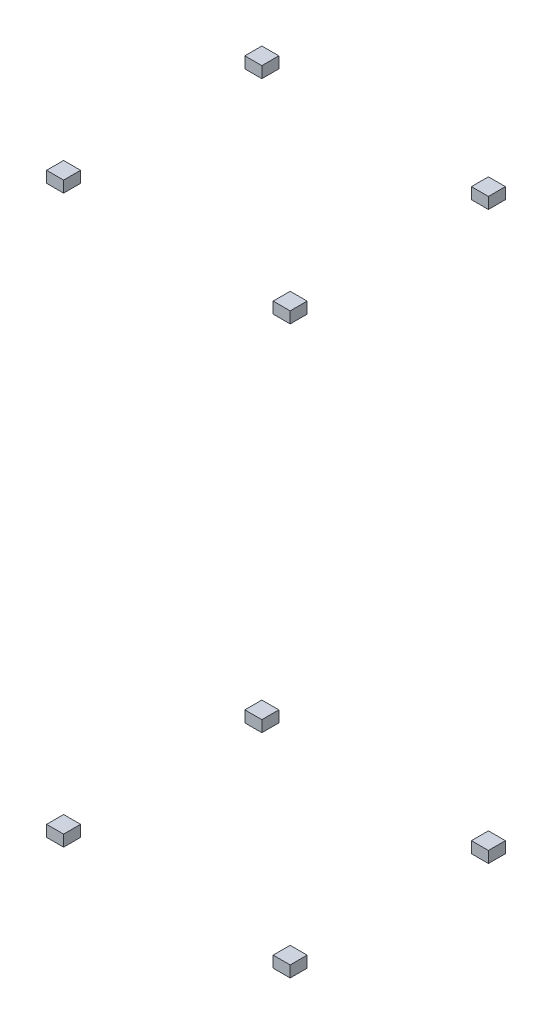
ISO-10303-21;
HEADER;
FILE_DESCRIPTION(('STEP AP214'),'2;1');
FILE_NAME('part.step','',(''),(''),'','','');
FILE_SCHEMA(('AUTOMOTIVE_DESIGN { 1 0 10303 214 1 1 1 1 }'));
ENDSEC;
DATA;
#1=APPLICATION_CONTEXT('core data for automotive mechanical design processes');
#2=APPLICATION_PROTOCOL_DEFINITION('international standard','automotive_design',2000,#1);
#3=PRODUCT_CONTEXT('',#1,'mechanical');
#4=PRODUCT('Part','Part','',(#3));
#5=PRODUCT_RELATED_PRODUCT_CATEGORY('part','',(#4));
#6=PRODUCT_DEFINITION_FORMATION('','',#4);
#7=PRODUCT_DEFINITION_CONTEXT('part definition',#1,'design');
#8=PRODUCT_DEFINITION('design','',#6,#7);
#9=PRODUCT_DEFINITION_SHAPE('','',#8);
#10=(LENGTH_UNIT() NAMED_UNIT(*) SI_UNIT(.MILLI.,.METRE.));
#11=(NAMED_UNIT(*) PLANE_ANGLE_UNIT() SI_UNIT($,.RADIAN.));
#12=(NAMED_UNIT(*) SI_UNIT($,.STERADIAN.) SOLID_ANGLE_UNIT());
#13=UNCERTAINTY_MEASURE_WITH_UNIT(LENGTH_MEASURE(1.E-05),#10,'distance_accuracy_value','');
#14=(GEOMETRIC_REPRESENTATION_CONTEXT(3) GLOBAL_UNCERTAINTY_ASSIGNED_CONTEXT((#13)) GLOBAL_UNIT_ASSIGNED_CONTEXT((#10,
#11,#12)) REPRESENTATION_CONTEXT('',''));
#15=CARTESIAN_POINT('',(0.,0.,0.));
#16=DIRECTION('',(0.,0.,1.));
#17=DIRECTION('',(1.,0.,0.));
#18=AXIS2_PLACEMENT_3D('',#15,#16,#17);
#19=CARTESIAN_POINT('',(740.,1960.,760.));
#20=DIRECTION('',(1.,0.,0.));
#21=DIRECTION('',(0.,0.,-1.));
#22=AXIS2_PLACEMENT_3D('',#19,#20,#21);
#23=PLANE('',#22);
#24=DIRECTION('',(0.,-1.,0.));
#25=VECTOR('',#24,1.);
#26=CARTESIAN_POINT('',(740.,1960.,640.));
#27=LINE('',#26,#25);
#28=CARTESIAN_POINT('',(740.,2040.,640.));
#29=VERTEX_POINT('',#28);
#30=CARTESIAN_POINT('',(740.,1960.,640.));
#31=VERTEX_POINT('',#30);
#32=EDGE_CURVE('E114',#29,#31,#27,.T.);
#33=ORIENTED_EDGE('',*,*,#32,.T.);
#34=DIRECTION('',(0.,0.,-1.));
#35=VECTOR('',#34,1.);
#36=CARTESIAN_POINT('',(740.,1960.,760.));
#37=LINE('',#36,#35);
#38=CARTESIAN_POINT('',(740.,1960.,760.));
#39=VERTEX_POINT('',#38);
#40=EDGE_CURVE('E12',#39,#31,#37,.T.);
#41=ORIENTED_EDGE('',*,*,#40,.F.);
#42=DIRECTION('',(0.,-1.,0.));
#43=VECTOR('',#42,1.);
#44=CARTESIAN_POINT('',(740.,1960.,760.));
#45=LINE('',#44,#43);
#46=CARTESIAN_POINT('',(740.,2040.,760.));
#47=VERTEX_POINT('',#46);
#48=EDGE_CURVE('E101',#47,#39,#45,.T.);
#49=ORIENTED_EDGE('',*,*,#48,.F.);
#50=DIRECTION('',(0.,0.,-1.));
#51=VECTOR('',#50,1.);
#52=CARTESIAN_POINT('',(740.,2040.,760.));
#53=LINE('',#52,#51);
#54=EDGE_CURVE('E108',#47,#29,#53,.T.);
#55=ORIENTED_EDGE('',*,*,#54,.T.);
#56=EDGE_LOOP('',(#33,#41,#49,#55));
#57=FACE_BOUND('',#56,.T.);
#58=ADVANCED_FACE('F49',(#57),#23,.F.);
#59=CARTESIAN_POINT('',(740.,1960.,760.));
#60=DIRECTION('',(0.,1.,0.));
#61=DIRECTION('',(0.,0.,1.));
#62=AXIS2_PLACEMENT_3D('',#59,#60,#61);
#63=PLANE('',#62);
#64=DIRECTION('',(1.,0.,0.));
#65=VECTOR('',#64,1.);
#66=CARTESIAN_POINT('',(740.,1960.,640.));
#67=LINE('',#66,#65);
#68=CARTESIAN_POINT('',(860.,1960.,640.));
#69=VERTEX_POINT('',#68);
#70=EDGE_CURVE('E104',#31,#69,#67,.T.);
#71=ORIENTED_EDGE('',*,*,#70,.T.);
#72=DIRECTION('',(0.,0.,-1.));
#73=VECTOR('',#72,1.);
#74=CARTESIAN_POINT('',(860.,1960.,760.));
#75=LINE('',#74,#73);
#76=CARTESIAN_POINT('',(860.,1960.,760.));
#77=VERTEX_POINT('',#76);
#78=EDGE_CURVE('E59',#77,#69,#75,.T.);
#79=ORIENTED_EDGE('',*,*,#78,.F.);
#80=DIRECTION('',(1.,0.,0.));
#81=VECTOR('',#80,1.);
#82=CARTESIAN_POINT('',(740.,1960.,760.));
#83=LINE('',#82,#81);
#84=EDGE_CURVE('E96',#39,#77,#83,.T.);
#85=ORIENTED_EDGE('',*,*,#84,.F.);
#86=ORIENTED_EDGE('',*,*,#40,.T.);
#87=EDGE_LOOP('',(#71,#79,#85,#86));
#88=FACE_BOUND('',#87,.T.);
#89=ADVANCED_FACE('F102',(#88),#63,.F.);
#90=CARTESIAN_POINT('',(860.,1960.,760.));
#91=DIRECTION('',(-1.,0.,0.));
#92=DIRECTION('',(0.,0.,1.));
#93=AXIS2_PLACEMENT_3D('',#90,#91,#92);
#94=PLANE('',#93);
#95=DIRECTION('',(0.,1.,0.));
#96=VECTOR('',#95,1.);
#97=CARTESIAN_POINT('',(860.,1960.,640.));
#98=LINE('',#97,#96);
#99=CARTESIAN_POINT('',(860.,2040.,640.));
#100=VERTEX_POINT('',#99);
#101=EDGE_CURVE('E84',#69,#100,#98,.T.);
#102=ORIENTED_EDGE('',*,*,#101,.T.);
#103=DIRECTION('',(0.,0.,-1.));
#104=VECTOR('',#103,1.);
#105=CARTESIAN_POINT('',(860.,2040.,760.));
#106=LINE('',#105,#104);
#107=CARTESIAN_POINT('',(860.,2040.,760.));
#108=VERTEX_POINT('',#107);
#109=EDGE_CURVE('E106',#108,#100,#106,.T.);
#110=ORIENTED_EDGE('',*,*,#109,.F.);
#111=DIRECTION('',(0.,1.,0.));
#112=VECTOR('',#111,1.);
#113=CARTESIAN_POINT('',(860.,1960.,760.));
#114=LINE('',#113,#112);
#115=EDGE_CURVE('E97',#77,#108,#114,.T.);
#116=ORIENTED_EDGE('',*,*,#115,.F.);
#117=ORIENTED_EDGE('',*,*,#78,.T.);
#118=EDGE_LOOP('',(#102,#110,#116,#117));
#119=FACE_BOUND('',#118,.T.);
#120=ADVANCED_FACE('F110',(#119),#94,.F.);
#121=CARTESIAN_POINT('',(740.,2040.,760.));
#122=DIRECTION('',(0.,-1.,0.));
#123=DIRECTION('',(0.,0.,-1.));
#124=AXIS2_PLACEMENT_3D('',#121,#122,#123);
#125=PLANE('',#124);
#126=DIRECTION('',(-1.,0.,0.));
#127=VECTOR('',#126,1.);
#128=CARTESIAN_POINT('',(740.,2040.,640.));
#129=LINE('',#128,#127);
#130=EDGE_CURVE('E90',#100,#29,#129,.T.);
#131=ORIENTED_EDGE('',*,*,#130,.T.);
#132=ORIENTED_EDGE('',*,*,#54,.F.);
#133=DIRECTION('',(-1.,0.,0.));
#134=VECTOR('',#133,1.);
#135=CARTESIAN_POINT('',(740.,2040.,760.));
#136=LINE('',#135,#134);
#137=EDGE_CURVE('E67',#108,#47,#136,.T.);
#138=ORIENTED_EDGE('',*,*,#137,.F.);
#139=ORIENTED_EDGE('',*,*,#109,.T.);
#140=EDGE_LOOP('',(#131,#132,#138,#139));
#141=FACE_BOUND('',#140,.T.);
#142=ADVANCED_FACE('F118',(#141),#125,.F.);
#143=CARTESIAN_POINT('',(0.,0.,760.));
#144=DIRECTION('',(0.,0.,-1.));
#145=DIRECTION('',(-1.,0.,0.));
#146=AXIS2_PLACEMENT_3D('',#143,#144,#145);
#147=PLANE('',#146);
#148=ORIENTED_EDGE('',*,*,#48,.T.);
#149=ORIENTED_EDGE('',*,*,#84,.T.);
#150=ORIENTED_EDGE('',*,*,#115,.T.);
#151=ORIENTED_EDGE('',*,*,#137,.T.);
#152=EDGE_LOOP('',(#148,#149,#150,#151));
#153=FACE_BOUND('',#152,.T.);
#154=ADVANCED_FACE('F100',(#153),#147,.F.);
#155=CARTESIAN_POINT('',(0.,0.,640.));
#156=DIRECTION('',(0.,0.,-1.));
#157=DIRECTION('',(-1.,0.,0.));
#158=AXIS2_PLACEMENT_3D('',#155,#156,#157);
#159=PLANE('',#158);
#160=ORIENTED_EDGE('',*,*,#32,.F.);
#161=ORIENTED_EDGE('',*,*,#130,.F.);
#162=ORIENTED_EDGE('',*,*,#101,.F.);
#163=ORIENTED_EDGE('',*,*,#70,.F.);
#164=EDGE_LOOP('',(#160,#161,#162,#163));
#165=FACE_BOUND('',#164,.T.);
#166=ADVANCED_FACE('F124',(#165),#159,.T.);
#167=CLOSED_SHELL('',(#58,#89,#120,#142,#154,#166));
#168=MANIFOLD_SOLID_BREP('B2',#167);
#169=CARTESIAN_POINT('',(740.,1960.,-640.));
#170=DIRECTION('',(1.,0.,0.));
#171=DIRECTION('',(0.,0.,-1.));
#172=AXIS2_PLACEMENT_3D('',#169,#170,#171);
#173=PLANE('',#172);
#174=DIRECTION('',(0.,-1.,0.));
#175=VECTOR('',#174,1.);
#176=CARTESIAN_POINT('',(740.,1960.,-760.));
#177=LINE('',#176,#175);
#178=CARTESIAN_POINT('',(740.,2040.,-760.));
#179=VERTEX_POINT('',#178);
#180=CARTESIAN_POINT('',(740.,1960.,-760.));
#181=VERTEX_POINT('',#180);
#182=EDGE_CURVE('E250',#179,#181,#177,.T.);
#183=ORIENTED_EDGE('',*,*,#182,.T.);
#184=DIRECTION('',(0.,0.,-1.));
#185=VECTOR('',#184,1.);
#186=CARTESIAN_POINT('',(740.,1960.,-640.));
#187=LINE('',#186,#185);
#188=CARTESIAN_POINT('',(740.,1960.,-640.));
#189=VERTEX_POINT('',#188);
#190=EDGE_CURVE('E48',#189,#181,#187,.T.);
#191=ORIENTED_EDGE('',*,*,#190,.F.);
#192=DIRECTION('',(0.,-1.,0.));
#193=VECTOR('',#192,1.);
#194=CARTESIAN_POINT('',(740.,1960.,-640.));
#195=LINE('',#194,#193);
#196=CARTESIAN_POINT('',(740.,2040.,-640.));
#197=VERTEX_POINT('',#196);
#198=EDGE_CURVE('E233',#197,#189,#195,.T.);
#199=ORIENTED_EDGE('',*,*,#198,.F.);
#200=DIRECTION('',(0.,0.,-1.));
#201=VECTOR('',#200,1.);
#202=CARTESIAN_POINT('',(740.,2040.,-640.));
#203=LINE('',#202,#201);
#204=EDGE_CURVE('E245',#197,#179,#203,.T.);
#205=ORIENTED_EDGE('',*,*,#204,.T.);
#206=EDGE_LOOP('',(#183,#191,#199,#205));
#207=FACE_BOUND('',#206,.T.);
#208=ADVANCED_FACE('F184',(#207),#173,.F.);
#209=CARTESIAN_POINT('',(740.,1960.,-640.));
#210=DIRECTION('',(0.,1.,0.));
#211=DIRECTION('',(0.,0.,1.));
#212=AXIS2_PLACEMENT_3D('',#209,#210,#211);
#213=PLANE('',#212);
#214=DIRECTION('',(1.,0.,0.));
#215=VECTOR('',#214,1.);
#216=CARTESIAN_POINT('',(740.,1960.,-760.));
#217=LINE('',#216,#215);
#218=CARTESIAN_POINT('',(860.,1960.,-760.));
#219=VERTEX_POINT('',#218);
#220=EDGE_CURVE('E239',#181,#219,#217,.T.);
#221=ORIENTED_EDGE('',*,*,#220,.T.);
#222=DIRECTION('',(0.,0.,-1.));
#223=VECTOR('',#222,1.);
#224=CARTESIAN_POINT('',(860.,1960.,-640.));
#225=LINE('',#224,#223);
#226=CARTESIAN_POINT('',(860.,1960.,-640.));
#227=VERTEX_POINT('',#226);
#228=EDGE_CURVE('E195',#227,#219,#225,.T.);
#229=ORIENTED_EDGE('',*,*,#228,.F.);
#230=DIRECTION('',(1.,0.,0.));
#231=VECTOR('',#230,1.);
#232=CARTESIAN_POINT('',(740.,1960.,-640.));
#233=LINE('',#232,#231);
#234=EDGE_CURVE('E228',#189,#227,#233,.T.);
#235=ORIENTED_EDGE('',*,*,#234,.F.);
#236=ORIENTED_EDGE('',*,*,#190,.T.);
#237=EDGE_LOOP('',(#221,#229,#235,#236));
#238=FACE_BOUND('',#237,.T.);
#239=ADVANCED_FACE('F236',(#238),#213,.F.);
#240=CARTESIAN_POINT('',(860.,1960.,-640.));
#241=DIRECTION('',(-1.,0.,0.));
#242=DIRECTION('',(0.,0.,1.));
#243=AXIS2_PLACEMENT_3D('',#240,#241,#242);
#244=PLANE('',#243);
#245=DIRECTION('',(0.,1.,0.));
#246=VECTOR('',#245,1.);
#247=CARTESIAN_POINT('',(860.,1960.,-760.));
#248=LINE('',#247,#246);
#249=CARTESIAN_POINT('',(860.,2040.,-760.));
#250=VERTEX_POINT('',#249);
#251=EDGE_CURVE('E220',#219,#250,#248,.T.);
#252=ORIENTED_EDGE('',*,*,#251,.T.);
#253=DIRECTION('',(0.,0.,-1.));
#254=VECTOR('',#253,1.);
#255=CARTESIAN_POINT('',(860.,2040.,-640.));
#256=LINE('',#255,#254);
#257=CARTESIAN_POINT('',(860.,2040.,-640.));
#258=VERTEX_POINT('',#257);
#259=EDGE_CURVE('E238',#258,#250,#256,.T.);
#260=ORIENTED_EDGE('',*,*,#259,.F.);
#261=DIRECTION('',(0.,1.,0.));
#262=VECTOR('',#261,1.);
#263=CARTESIAN_POINT('',(860.,1960.,-640.));
#264=LINE('',#263,#262);
#265=EDGE_CURVE('E234',#227,#258,#264,.T.);
#266=ORIENTED_EDGE('',*,*,#265,.F.);
#267=ORIENTED_EDGE('',*,*,#228,.T.);
#268=EDGE_LOOP('',(#252,#260,#266,#267));
#269=FACE_BOUND('',#268,.T.);
#270=ADVANCED_FACE('F242',(#269),#244,.F.);
#271=CARTESIAN_POINT('',(740.,2040.,-640.));
#272=DIRECTION('',(0.,-1.,0.));
#273=DIRECTION('',(0.,0.,-1.));
#274=AXIS2_PLACEMENT_3D('',#271,#272,#273);
#275=PLANE('',#274);
#276=DIRECTION('',(-1.,0.,0.));
#277=VECTOR('',#276,1.);
#278=CARTESIAN_POINT('',(740.,2040.,-760.));
#279=LINE('',#278,#277);
#280=EDGE_CURVE('E224',#250,#179,#279,.T.);
#281=ORIENTED_EDGE('',*,*,#280,.T.);
#282=ORIENTED_EDGE('',*,*,#204,.F.);
#283=DIRECTION('',(-1.,0.,0.));
#284=VECTOR('',#283,1.);
#285=CARTESIAN_POINT('',(740.,2040.,-640.));
#286=LINE('',#285,#284);
#287=EDGE_CURVE('E199',#258,#197,#286,.T.);
#288=ORIENTED_EDGE('',*,*,#287,.F.);
#289=ORIENTED_EDGE('',*,*,#259,.T.);
#290=EDGE_LOOP('',(#281,#282,#288,#289));
#291=FACE_BOUND('',#290,.T.);
#292=ADVANCED_FACE('F255',(#291),#275,.F.);
#293=CARTESIAN_POINT('',(0.,0.,-640.));
#294=DIRECTION('',(0.,0.,-1.));
#295=DIRECTION('',(-1.,0.,0.));
#296=AXIS2_PLACEMENT_3D('',#293,#294,#295);
#297=PLANE('',#296);
#298=ORIENTED_EDGE('',*,*,#198,.T.);
#299=ORIENTED_EDGE('',*,*,#234,.T.);
#300=ORIENTED_EDGE('',*,*,#265,.T.);
#301=ORIENTED_EDGE('',*,*,#287,.T.);
#302=EDGE_LOOP('',(#298,#299,#300,#301));
#303=FACE_BOUND('',#302,.T.);
#304=ADVANCED_FACE('F232',(#303),#297,.F.);
#305=CARTESIAN_POINT('',(0.,0.,-760.));
#306=DIRECTION('',(0.,0.,-1.));
#307=DIRECTION('',(-1.,0.,0.));
#308=AXIS2_PLACEMENT_3D('',#305,#306,#307);
#309=PLANE('',#308);
#310=ORIENTED_EDGE('',*,*,#182,.F.);
#311=ORIENTED_EDGE('',*,*,#280,.F.);
#312=ORIENTED_EDGE('',*,*,#251,.F.);
#313=ORIENTED_EDGE('',*,*,#220,.F.);
#314=EDGE_LOOP('',(#310,#311,#312,#313));
#315=FACE_BOUND('',#314,.T.);
#316=ADVANCED_FACE('F260',(#315),#309,.T.);
#317=CLOSED_SHELL('',(#208,#239,#270,#292,#304,#316));
#318=MANIFOLD_SOLID_BREP('B6',#317);
#319=CARTESIAN_POINT('',(740.,-2040.,760.));
#320=DIRECTION('',(1.,0.,0.));
#321=DIRECTION('',(0.,0.,-1.));
#322=AXIS2_PLACEMENT_3D('',#319,#320,#321);
#323=PLANE('',#322);
#324=DIRECTION('',(0.,-1.,0.));
#325=VECTOR('',#324,1.);
#326=CARTESIAN_POINT('',(740.,-2040.,640.));
#327=LINE('',#326,#325);
#328=CARTESIAN_POINT('',(740.,-1960.,640.));
#329=VERTEX_POINT('',#328);
#330=CARTESIAN_POINT('',(740.,-2040.,640.));
#331=VERTEX_POINT('',#330);
#332=EDGE_CURVE('E381',#329,#331,#327,.T.);
#333=ORIENTED_EDGE('',*,*,#332,.T.);
#334=DIRECTION('',(0.,0.,-1.));
#335=VECTOR('',#334,1.);
#336=CARTESIAN_POINT('',(740.,-2040.,760.));
#337=LINE('',#336,#335);
#338=CARTESIAN_POINT('',(740.,-2040.,760.));
#339=VERTEX_POINT('',#338);
#340=EDGE_CURVE('E185',#339,#331,#337,.T.);
#341=ORIENTED_EDGE('',*,*,#340,.F.);
#342=DIRECTION('',(0.,-1.,0.));
#343=VECTOR('',#342,1.);
#344=CARTESIAN_POINT('',(740.,-2040.,760.));
#345=LINE('',#344,#343);
#346=CARTESIAN_POINT('',(740.,-1960.,760.));
#347=VERTEX_POINT('',#346);
#348=EDGE_CURVE('E369',#347,#339,#345,.T.);
#349=ORIENTED_EDGE('',*,*,#348,.F.);
#350=DIRECTION('',(0.,0.,-1.));
#351=VECTOR('',#350,1.);
#352=CARTESIAN_POINT('',(740.,-1960.,760.));
#353=LINE('',#352,#351);
#354=EDGE_CURVE('E380',#347,#329,#353,.T.);
#355=ORIENTED_EDGE('',*,*,#354,.T.);
#356=EDGE_LOOP('',(#333,#341,#349,#355));
#357=FACE_BOUND('',#356,.T.);
#358=ADVANCED_FACE('F318',(#357),#323,.F.);
#359=CARTESIAN_POINT('',(740.,-2040.,760.));
#360=DIRECTION('',(0.,1.,0.));
#361=DIRECTION('',(0.,0.,1.));
#362=AXIS2_PLACEMENT_3D('',#359,#360,#361);
#363=PLANE('',#362);
#364=DIRECTION('',(1.,0.,0.));
#365=VECTOR('',#364,1.);
#366=CARTESIAN_POINT('',(740.,-2040.,640.));
#367=LINE('',#366,#365);
#368=CARTESIAN_POINT('',(860.,-2040.,640.));
#369=VERTEX_POINT('',#368);
#370=EDGE_CURVE('E373',#331,#369,#367,.T.);
#371=ORIENTED_EDGE('',*,*,#370,.T.);
#372=DIRECTION('',(0.,0.,-1.));
#373=VECTOR('',#372,1.);
#374=CARTESIAN_POINT('',(860.,-2040.,760.));
#375=LINE('',#374,#373);
#376=CARTESIAN_POINT('',(860.,-2040.,760.));
#377=VERTEX_POINT('',#376);
#378=EDGE_CURVE('E326',#377,#369,#375,.T.);
#379=ORIENTED_EDGE('',*,*,#378,.F.);
#380=DIRECTION('',(1.,0.,0.));
#381=VECTOR('',#380,1.);
#382=CARTESIAN_POINT('',(740.,-2040.,760.));
#383=LINE('',#382,#381);
#384=EDGE_CURVE('E365',#339,#377,#383,.T.);
#385=ORIENTED_EDGE('',*,*,#384,.F.);
#386=ORIENTED_EDGE('',*,*,#340,.T.);
#387=EDGE_LOOP('',(#371,#379,#385,#386));
#388=FACE_BOUND('',#387,.T.);
#389=ADVANCED_FACE('F375',(#388),#363,.F.);
#390=CARTESIAN_POINT('',(860.,-2040.,760.));
#391=DIRECTION('',(-1.,0.,0.));
#392=DIRECTION('',(0.,0.,1.));
#393=AXIS2_PLACEMENT_3D('',#390,#391,#392);
#394=PLANE('',#393);
#395=DIRECTION('',(0.,1.,0.));
#396=VECTOR('',#395,1.);
#397=CARTESIAN_POINT('',(860.,-2040.,640.));
#398=LINE('',#397,#396);
#399=CARTESIAN_POINT('',(860.,-1960.,640.));
#400=VERTEX_POINT('',#399);
#401=EDGE_CURVE('E352',#369,#400,#398,.T.);
#402=ORIENTED_EDGE('',*,*,#401,.T.);
#403=DIRECTION('',(0.,0.,-1.));
#404=VECTOR('',#403,1.);
#405=CARTESIAN_POINT('',(860.,-1960.,760.));
#406=LINE('',#405,#404);
#407=CARTESIAN_POINT('',(860.,-1960.,760.));
#408=VERTEX_POINT('',#407);
#409=EDGE_CURVE('E372',#408,#400,#406,.T.);
#410=ORIENTED_EDGE('',*,*,#409,.F.);
#411=DIRECTION('',(0.,1.,0.));
#412=VECTOR('',#411,1.);
#413=CARTESIAN_POINT('',(860.,-2040.,760.));
#414=LINE('',#413,#412);
#415=EDGE_CURVE('E370',#377,#408,#414,.T.);
#416=ORIENTED_EDGE('',*,*,#415,.F.);
#417=ORIENTED_EDGE('',*,*,#378,.T.);
#418=EDGE_LOOP('',(#402,#410,#416,#417));
#419=FACE_BOUND('',#418,.T.);
#420=ADVANCED_FACE('F374',(#419),#394,.F.);
#421=CARTESIAN_POINT('',(740.,-1960.,760.));
#422=DIRECTION('',(0.,-1.,0.));
#423=DIRECTION('',(0.,0.,-1.));
#424=AXIS2_PLACEMENT_3D('',#421,#422,#423);
#425=PLANE('',#424);
#426=DIRECTION('',(-1.,0.,0.));
#427=VECTOR('',#426,1.);
#428=CARTESIAN_POINT('',(740.,-1960.,640.));
#429=LINE('',#428,#427);
#430=EDGE_CURVE('E360',#400,#329,#429,.T.);
#431=ORIENTED_EDGE('',*,*,#430,.T.);
#432=ORIENTED_EDGE('',*,*,#354,.F.);
#433=DIRECTION('',(-1.,0.,0.));
#434=VECTOR('',#433,1.);
#435=CARTESIAN_POINT('',(740.,-1960.,760.));
#436=LINE('',#435,#434);
#437=EDGE_CURVE('E331',#408,#347,#436,.T.);
#438=ORIENTED_EDGE('',*,*,#437,.F.);
#439=ORIENTED_EDGE('',*,*,#409,.T.);
#440=EDGE_LOOP('',(#431,#432,#438,#439));
#441=FACE_BOUND('',#440,.T.);
#442=ADVANCED_FACE('F389',(#441),#425,.F.);
#443=CARTESIAN_POINT('',(0.,0.,760.));
#444=DIRECTION('',(0.,0.,-1.));
#445=DIRECTION('',(-1.,0.,0.));
#446=AXIS2_PLACEMENT_3D('',#443,#444,#445);
#447=PLANE('',#446);
#448=ORIENTED_EDGE('',*,*,#348,.T.);
#449=ORIENTED_EDGE('',*,*,#384,.T.);
#450=ORIENTED_EDGE('',*,*,#415,.T.);
#451=ORIENTED_EDGE('',*,*,#437,.T.);
#452=EDGE_LOOP('',(#448,#449,#450,#451));
#453=FACE_BOUND('',#452,.T.);
#454=ADVANCED_FACE('F364',(#453),#447,.F.);
#455=CARTESIAN_POINT('',(0.,0.,640.));
#456=DIRECTION('',(0.,0.,-1.));
#457=DIRECTION('',(-1.,0.,0.));
#458=AXIS2_PLACEMENT_3D('',#455,#456,#457);
#459=PLANE('',#458);
#460=ORIENTED_EDGE('',*,*,#332,.F.);
#461=ORIENTED_EDGE('',*,*,#430,.F.);
#462=ORIENTED_EDGE('',*,*,#401,.F.);
#463=ORIENTED_EDGE('',*,*,#370,.F.);
#464=EDGE_LOOP('',(#460,#461,#462,#463));
#465=FACE_BOUND('',#464,.T.);
#466=ADVANCED_FACE('F392',(#465),#459,.T.);
#467=CLOSED_SHELL('',(#358,#389,#420,#442,#454,#466));
#468=MANIFOLD_SOLID_BREP('B45',#467);
#469=CARTESIAN_POINT('',(740.,-2040.,-640.));
#470=DIRECTION('',(1.,0.,0.));
#471=DIRECTION('',(0.,0.,-1.));
#472=AXIS2_PLACEMENT_3D('',#469,#470,#471);
#473=PLANE('',#472);
#474=DIRECTION('',(0.,-1.,0.));
#475=VECTOR('',#474,1.);
#476=CARTESIAN_POINT('',(740.,-2040.,-760.));
#477=LINE('',#476,#475);
#478=CARTESIAN_POINT('',(740.,-1960.,-760.));
#479=VERTEX_POINT('',#478);
#480=CARTESIAN_POINT('',(740.,-2040.,-760.));
#481=VERTEX_POINT('',#480);
#482=EDGE_CURVE('E513',#479,#481,#477,.T.);
#483=ORIENTED_EDGE('',*,*,#482,.T.);
#484=DIRECTION('',(0.,0.,-1.));
#485=VECTOR('',#484,1.);
#486=CARTESIAN_POINT('',(740.,-2040.,-640.));
#487=LINE('',#486,#485);
#488=CARTESIAN_POINT('',(740.,-2040.,-640.));
#489=VERTEX_POINT('',#488);
#490=EDGE_CURVE('E316',#489,#481,#487,.T.);
#491=ORIENTED_EDGE('',*,*,#490,.F.);
#492=DIRECTION('',(0.,-1.,0.));
#493=VECTOR('',#492,1.);
#494=CARTESIAN_POINT('',(740.,-2040.,-640.));
#495=LINE('',#494,#493);
#496=CARTESIAN_POINT('',(740.,-1960.,-640.));
#497=VERTEX_POINT('',#496);
#498=EDGE_CURVE('E505',#497,#489,#495,.T.);
#499=ORIENTED_EDGE('',*,*,#498,.F.);
#500=DIRECTION('',(0.,0.,-1.));
#501=VECTOR('',#500,1.);
#502=CARTESIAN_POINT('',(740.,-1960.,-640.));
#503=LINE('',#502,#501);
#504=EDGE_CURVE('E512',#497,#479,#503,.T.);
#505=ORIENTED_EDGE('',*,*,#504,.T.);
#506=EDGE_LOOP('',(#483,#491,#499,#505));
#507=FACE_BOUND('',#506,.T.);
#508=ADVANCED_FACE('F455',(#507),#473,.F.);
#509=CARTESIAN_POINT('',(740.,-2040.,-640.));
#510=DIRECTION('',(0.,1.,0.));
#511=DIRECTION('',(0.,0.,1.));
#512=AXIS2_PLACEMENT_3D('',#509,#510,#511);
#513=PLANE('',#512);
#514=DIRECTION('',(1.,0.,0.));
#515=VECTOR('',#514,1.);
#516=CARTESIAN_POINT('',(740.,-2040.,-760.));
#517=LINE('',#516,#515);
#518=CARTESIAN_POINT('',(860.,-2040.,-760.));
#519=VERTEX_POINT('',#518);
#520=EDGE_CURVE('E510',#481,#519,#517,.T.);
#521=ORIENTED_EDGE('',*,*,#520,.T.);
#522=DIRECTION('',(0.,0.,-1.));
#523=VECTOR('',#522,1.);
#524=CARTESIAN_POINT('',(860.,-2040.,-640.));
#525=LINE('',#524,#523);
#526=CARTESIAN_POINT('',(860.,-2040.,-640.));
#527=VERTEX_POINT('',#526);
#528=EDGE_CURVE('E458',#527,#519,#525,.T.);
#529=ORIENTED_EDGE('',*,*,#528,.F.);
#530=DIRECTION('',(1.,0.,0.));
#531=VECTOR('',#530,1.);
#532=CARTESIAN_POINT('',(740.,-2040.,-640.));
#533=LINE('',#532,#531);
#534=EDGE_CURVE('E499',#489,#527,#533,.T.);
#535=ORIENTED_EDGE('',*,*,#534,.F.);
#536=ORIENTED_EDGE('',*,*,#490,.T.);
#537=EDGE_LOOP('',(#521,#529,#535,#536));
#538=FACE_BOUND('',#537,.T.);
#539=ADVANCED_FACE('F507',(#538),#513,.F.);
#540=CARTESIAN_POINT('',(860.,-2040.,-640.));
#541=DIRECTION('',(-1.,0.,0.));
#542=DIRECTION('',(0.,0.,1.));
#543=AXIS2_PLACEMENT_3D('',#540,#541,#542);
#544=PLANE('',#543);
#545=DIRECTION('',(0.,1.,0.));
#546=VECTOR('',#545,1.);
#547=CARTESIAN_POINT('',(860.,-2040.,-760.));
#548=LINE('',#547,#546);
#549=CARTESIAN_POINT('',(860.,-1960.,-760.));
#550=VERTEX_POINT('',#549);
#551=EDGE_CURVE('E484',#519,#550,#548,.T.);
#552=ORIENTED_EDGE('',*,*,#551,.T.);
#553=DIRECTION('',(0.,0.,-1.));
#554=VECTOR('',#553,1.);
#555=CARTESIAN_POINT('',(860.,-1960.,-640.));
#556=LINE('',#555,#554);
#557=CARTESIAN_POINT('',(860.,-1960.,-640.));
#558=VERTEX_POINT('',#557);
#559=EDGE_CURVE('E509',#558,#550,#556,.T.);
#560=ORIENTED_EDGE('',*,*,#559,.F.);
#561=DIRECTION('',(0.,1.,0.));
#562=VECTOR('',#561,1.);
#563=CARTESIAN_POINT('',(860.,-2040.,-640.));
#564=LINE('',#563,#562);
#565=EDGE_CURVE('E502',#527,#558,#564,.T.);
#566=ORIENTED_EDGE('',*,*,#565,.F.);
#567=ORIENTED_EDGE('',*,*,#528,.T.);
#568=EDGE_LOOP('',(#552,#560,#566,#567));
#569=FACE_BOUND('',#568,.T.);
#570=ADVANCED_FACE('F506',(#569),#544,.F.);
#571=CARTESIAN_POINT('',(740.,-1960.,-640.));
#572=DIRECTION('',(0.,-1.,0.));
#573=DIRECTION('',(0.,0.,-1.));
#574=AXIS2_PLACEMENT_3D('',#571,#572,#573);
#575=PLANE('',#574);
#576=DIRECTION('',(-1.,0.,0.));
#577=VECTOR('',#576,1.);
#578=CARTESIAN_POINT('',(740.,-1960.,-760.));
#579=LINE('',#578,#577);
#580=EDGE_CURVE('E491',#550,#479,#579,.T.);
#581=ORIENTED_EDGE('',*,*,#580,.T.);
#582=ORIENTED_EDGE('',*,*,#504,.F.);
#583=DIRECTION('',(-1.,0.,0.));
#584=VECTOR('',#583,1.);
#585=CARTESIAN_POINT('',(740.,-1960.,-640.));
#586=LINE('',#585,#584);
#587=EDGE_CURVE('E469',#558,#497,#586,.T.);
#588=ORIENTED_EDGE('',*,*,#587,.F.);
#589=ORIENTED_EDGE('',*,*,#559,.T.);
#590=EDGE_LOOP('',(#581,#582,#588,#589));
#591=FACE_BOUND('',#590,.T.);
#592=ADVANCED_FACE('F525',(#591),#575,.F.);
#593=CARTESIAN_POINT('',(0.,0.,-640.));
#594=DIRECTION('',(0.,0.,-1.));
#595=DIRECTION('',(-1.,0.,0.));
#596=AXIS2_PLACEMENT_3D('',#593,#594,#595);
#597=PLANE('',#596);
#598=ORIENTED_EDGE('',*,*,#498,.T.);
#599=ORIENTED_EDGE('',*,*,#534,.T.);
#600=ORIENTED_EDGE('',*,*,#565,.T.);
#601=ORIENTED_EDGE('',*,*,#587,.T.);
#602=EDGE_LOOP('',(#598,#599,#600,#601));
#603=FACE_BOUND('',#602,.T.);
#604=ADVANCED_FACE('F496',(#603),#597,.F.);
#605=CARTESIAN_POINT('',(0.,0.,-760.));
#606=DIRECTION('',(0.,0.,-1.));
#607=DIRECTION('',(-1.,0.,0.));
#608=AXIS2_PLACEMENT_3D('',#605,#606,#607);
#609=PLANE('',#608);
#610=ORIENTED_EDGE('',*,*,#482,.F.);
#611=ORIENTED_EDGE('',*,*,#580,.F.);
#612=ORIENTED_EDGE('',*,*,#551,.F.);
#613=ORIENTED_EDGE('',*,*,#520,.F.);
#614=EDGE_LOOP('',(#610,#611,#612,#613));
#615=FACE_BOUND('',#614,.T.);
#616=ADVANCED_FACE('F523',(#615),#609,.T.);
#617=CLOSED_SHELL('',(#508,#539,#570,#592,#604,#616));
#618=MANIFOLD_SOLID_BREP('B177',#617);
#619=CARTESIAN_POINT('',(-860.,1960.,760.));
#620=DIRECTION('',(1.,0.,0.));
#621=DIRECTION('',(0.,0.,-1.));
#622=AXIS2_PLACEMENT_3D('',#619,#620,#621);
#623=PLANE('',#622);
#624=DIRECTION('',(0.,-1.,0.));
#625=VECTOR('',#624,1.);
#626=CARTESIAN_POINT('',(-860.,1960.,640.));
#627=LINE('',#626,#625);
#628=CARTESIAN_POINT('',(-860.,2040.,640.));
#629=VERTEX_POINT('',#628);
#630=CARTESIAN_POINT('',(-860.,1960.,640.));
#631=VERTEX_POINT('',#630);
#632=EDGE_CURVE('E647',#629,#631,#627,.T.);
#633=ORIENTED_EDGE('',*,*,#632,.T.);
#634=DIRECTION('',(0.,0.,-1.));
#635=VECTOR('',#634,1.);
#636=CARTESIAN_POINT('',(-860.,1960.,760.));
#637=LINE('',#636,#635);
#638=CARTESIAN_POINT('',(-860.,1960.,760.));
#639=VERTEX_POINT('',#638);
#640=EDGE_CURVE('E448',#639,#631,#637,.T.);
#641=ORIENTED_EDGE('',*,*,#640,.F.);
#642=DIRECTION('',(0.,-1.,0.));
#643=VECTOR('',#642,1.);
#644=CARTESIAN_POINT('',(-860.,1960.,760.));
#645=LINE('',#644,#643);
#646=CARTESIAN_POINT('',(-860.,2040.,760.));
#647=VERTEX_POINT('',#646);
#648=EDGE_CURVE('E637',#647,#639,#645,.T.);
#649=ORIENTED_EDGE('',*,*,#648,.F.);
#650=DIRECTION('',(0.,0.,-1.));
#651=VECTOR('',#650,1.);
#652=CARTESIAN_POINT('',(-860.,2040.,760.));
#653=LINE('',#652,#651);
#654=EDGE_CURVE('E642',#647,#629,#653,.T.);
#655=ORIENTED_EDGE('',*,*,#654,.T.);
#656=EDGE_LOOP('',(#633,#641,#649,#655));
#657=FACE_BOUND('',#656,.T.);
#658=ADVANCED_FACE('F588',(#657),#623,.F.);
#659=CARTESIAN_POINT('',(-860.,1960.,760.));
#660=DIRECTION('',(0.,1.,0.));
#661=DIRECTION('',(0.,0.,1.));
#662=AXIS2_PLACEMENT_3D('',#659,#660,#661);
#663=PLANE('',#662);
#664=DIRECTION('',(1.,0.,0.));
#665=VECTOR('',#664,1.);
#666=CARTESIAN_POINT('',(-860.,1960.,640.));
#667=LINE('',#666,#665);
#668=CARTESIAN_POINT('',(-740.,1960.,640.));
#669=VERTEX_POINT('',#668);
#670=EDGE_CURVE('E643',#631,#669,#667,.T.);
#671=ORIENTED_EDGE('',*,*,#670,.T.);
#672=DIRECTION('',(0.,0.,-1.));
#673=VECTOR('',#672,1.);
#674=CARTESIAN_POINT('',(-740.,1960.,760.));
#675=LINE('',#674,#673);
#676=CARTESIAN_POINT('',(-740.,1960.,760.));
#677=VERTEX_POINT('',#676);
#678=EDGE_CURVE('E592',#677,#669,#675,.T.);
#679=ORIENTED_EDGE('',*,*,#678,.F.);
#680=DIRECTION('',(1.,0.,0.));
#681=VECTOR('',#680,1.);
#682=CARTESIAN_POINT('',(-860.,1960.,760.));
#683=LINE('',#682,#681);
#684=EDGE_CURVE('E635',#639,#677,#683,.T.);
#685=ORIENTED_EDGE('',*,*,#684,.F.);
#686=ORIENTED_EDGE('',*,*,#640,.T.);
#687=EDGE_LOOP('',(#671,#679,#685,#686));
#688=FACE_BOUND('',#687,.T.);
#689=ADVANCED_FACE('F639',(#688),#663,.F.);
#690=CARTESIAN_POINT('',(-740.,1960.,760.));
#691=DIRECTION('',(-1.,0.,0.));
#692=DIRECTION('',(0.,0.,1.));
#693=AXIS2_PLACEMENT_3D('',#690,#691,#692);
#694=PLANE('',#693);
#695=DIRECTION('',(0.,1.,0.));
#696=VECTOR('',#695,1.);
#697=CARTESIAN_POINT('',(-740.,1960.,640.));
#698=LINE('',#697,#696);
#699=CARTESIAN_POINT('',(-740.,2040.,640.));
#700=VERTEX_POINT('',#699);
#701=EDGE_CURVE('E616',#669,#700,#698,.T.);
#702=ORIENTED_EDGE('',*,*,#701,.T.);
#703=DIRECTION('',(0.,0.,-1.));
#704=VECTOR('',#703,1.);
#705=CARTESIAN_POINT('',(-740.,2040.,760.));
#706=LINE('',#705,#704);
#707=CARTESIAN_POINT('',(-740.,2040.,760.));
#708=VERTEX_POINT('',#707);
#709=EDGE_CURVE('E645',#708,#700,#706,.T.);
#710=ORIENTED_EDGE('',*,*,#709,.F.);
#711=DIRECTION('',(0.,1.,0.));
#712=VECTOR('',#711,1.);
#713=CARTESIAN_POINT('',(-740.,1960.,760.));
#714=LINE('',#713,#712);
#715=EDGE_CURVE('E633',#677,#708,#714,.T.);
#716=ORIENTED_EDGE('',*,*,#715,.F.);
#717=ORIENTED_EDGE('',*,*,#678,.T.);
#718=EDGE_LOOP('',(#702,#710,#716,#717));
#719=FACE_BOUND('',#718,.T.);
#720=ADVANCED_FACE('F641',(#719),#694,.F.);
#721=CARTESIAN_POINT('',(-860.,2040.,760.));
#722=DIRECTION('',(0.,-1.,0.));
#723=DIRECTION('',(0.,0.,-1.));
#724=AXIS2_PLACEMENT_3D('',#721,#722,#723);
#725=PLANE('',#724);
#726=DIRECTION('',(-1.,0.,0.));
#727=VECTOR('',#726,1.);
#728=CARTESIAN_POINT('',(-860.,2040.,640.));
#729=LINE('',#728,#727);
#730=EDGE_CURVE('E623',#700,#629,#729,.T.);
#731=ORIENTED_EDGE('',*,*,#730,.T.);
#732=ORIENTED_EDGE('',*,*,#654,.F.);
#733=DIRECTION('',(-1.,0.,0.));
#734=VECTOR('',#733,1.);
#735=CARTESIAN_POINT('',(-860.,2040.,760.));
#736=LINE('',#735,#734);
#737=EDGE_CURVE('E605',#708,#647,#736,.T.);
#738=ORIENTED_EDGE('',*,*,#737,.F.);
#739=ORIENTED_EDGE('',*,*,#709,.T.);
#740=EDGE_LOOP('',(#731,#732,#738,#739));
#741=FACE_BOUND('',#740,.T.);
#742=ADVANCED_FACE('F656',(#741),#725,.F.);
#743=CARTESIAN_POINT('',(0.,0.,760.));
#744=DIRECTION('',(0.,0.,-1.));
#745=DIRECTION('',(-1.,0.,0.));
#746=AXIS2_PLACEMENT_3D('',#743,#744,#745);
#747=PLANE('',#746);
#748=ORIENTED_EDGE('',*,*,#648,.T.);
#749=ORIENTED_EDGE('',*,*,#684,.T.);
#750=ORIENTED_EDGE('',*,*,#715,.T.);
#751=ORIENTED_EDGE('',*,*,#737,.T.);
#752=EDGE_LOOP('',(#748,#749,#750,#751));
#753=FACE_BOUND('',#752,.T.);
#754=ADVANCED_FACE('F634',(#753),#747,.F.);
#755=CARTESIAN_POINT('',(0.,0.,640.));
#756=DIRECTION('',(0.,0.,-1.));
#757=DIRECTION('',(-1.,0.,0.));
#758=AXIS2_PLACEMENT_3D('',#755,#756,#757);
#759=PLANE('',#758);
#760=ORIENTED_EDGE('',*,*,#632,.F.);
#761=ORIENTED_EDGE('',*,*,#730,.F.);
#762=ORIENTED_EDGE('',*,*,#701,.F.);
#763=ORIENTED_EDGE('',*,*,#670,.F.);
#764=EDGE_LOOP('',(#760,#761,#762,#763));
#765=FACE_BOUND('',#764,.T.);
#766=ADVANCED_FACE('F658',(#765),#759,.T.);
#767=CLOSED_SHELL('',(#658,#689,#720,#742,#754,#766));
#768=MANIFOLD_SOLID_BREP('B309',#767);
#769=CARTESIAN_POINT('',(-860.,1960.,-640.));
#770=DIRECTION('',(1.,0.,0.));
#771=DIRECTION('',(0.,0.,-1.));
#772=AXIS2_PLACEMENT_3D('',#769,#770,#771);
#773=PLANE('',#772);
#774=DIRECTION('',(0.,-1.,0.));
#775=VECTOR('',#774,1.);
#776=CARTESIAN_POINT('',(-860.,1960.,-760.));
#777=LINE('',#776,#775);
#778=CARTESIAN_POINT('',(-860.,2040.,-760.));
#779=VERTEX_POINT('',#778);
#780=CARTESIAN_POINT('',(-860.,1960.,-760.));
#781=VERTEX_POINT('',#780);
#782=EDGE_CURVE('E784',#779,#781,#777,.T.);
#783=ORIENTED_EDGE('',*,*,#782,.T.);
#784=DIRECTION('',(0.,0.,-1.));
#785=VECTOR('',#784,1.);
#786=CARTESIAN_POINT('',(-860.,1960.,-640.));
#787=LINE('',#786,#785);
#788=CARTESIAN_POINT('',(-860.,1960.,-640.));
#789=VERTEX_POINT('',#788);
#790=EDGE_CURVE('E585',#789,#781,#787,.T.);
#791=ORIENTED_EDGE('',*,*,#790,.F.);
#792=DIRECTION('',(0.,-1.,0.));
#793=VECTOR('',#792,1.);
#794=CARTESIAN_POINT('',(-860.,1960.,-640.));
#795=LINE('',#794,#793);
#796=CARTESIAN_POINT('',(-860.,2040.,-640.));
#797=VERTEX_POINT('',#796);
#798=EDGE_CURVE('E772',#797,#789,#795,.T.);
#799=ORIENTED_EDGE('',*,*,#798,.F.);
#800=DIRECTION('',(0.,0.,-1.));
#801=VECTOR('',#800,1.);
#802=CARTESIAN_POINT('',(-860.,2040.,-640.));
#803=LINE('',#802,#801);
#804=EDGE_CURVE('E776',#797,#779,#803,.T.);
#805=ORIENTED_EDGE('',*,*,#804,.T.);
#806=EDGE_LOOP('',(#783,#791,#799,#805));
#807=FACE_BOUND('',#806,.T.);
#808=ADVANCED_FACE('F718',(#807),#773,.F.);
#809=CARTESIAN_POINT('',(-860.,1960.,-640.));
#810=DIRECTION('',(0.,1.,0.));
#811=DIRECTION('',(0.,0.,1.));
#812=AXIS2_PLACEMENT_3D('',#809,#810,#811);
#813=PLANE('',#812);
#814=DIRECTION('',(1.,0.,0.));
#815=VECTOR('',#814,1.);
#816=CARTESIAN_POINT('',(-860.,1960.,-760.));
#817=LINE('',#816,#815);
#818=CARTESIAN_POINT('',(-740.,1960.,-760.));
#819=VERTEX_POINT('',#818);
#820=EDGE_CURVE('E773',#781,#819,#817,.T.);
#821=ORIENTED_EDGE('',*,*,#820,.T.);
#822=DIRECTION('',(0.,0.,-1.));
#823=VECTOR('',#822,1.);
#824=CARTESIAN_POINT('',(-740.,1960.,-640.));
#825=LINE('',#824,#823);
#826=CARTESIAN_POINT('',(-740.,1960.,-640.));
#827=VERTEX_POINT('',#826);
#828=EDGE_CURVE('E729',#827,#819,#825,.T.);
#829=ORIENTED_EDGE('',*,*,#828,.F.);
#830=DIRECTION('',(1.,0.,0.));
#831=VECTOR('',#830,1.);
#832=CARTESIAN_POINT('',(-860.,1960.,-640.));
#833=LINE('',#832,#831);
#834=EDGE_CURVE('E766',#789,#827,#833,.T.);
#835=ORIENTED_EDGE('',*,*,#834,.F.);
#836=ORIENTED_EDGE('',*,*,#790,.T.);
#837=EDGE_LOOP('',(#821,#829,#835,#836));
#838=FACE_BOUND('',#837,.T.);
#839=ADVANCED_FACE('F771',(#838),#813,.F.);
#840=CARTESIAN_POINT('',(-740.,1960.,-640.));
#841=DIRECTION('',(-1.,0.,0.));
#842=DIRECTION('',(0.,0.,1.));
#843=AXIS2_PLACEMENT_3D('',#840,#841,#842);
#844=PLANE('',#843);
#845=DIRECTION('',(0.,1.,0.));
#846=VECTOR('',#845,1.);
#847=CARTESIAN_POINT('',(-740.,1960.,-760.));
#848=LINE('',#847,#846);
#849=CARTESIAN_POINT('',(-740.,2040.,-760.));
#850=VERTEX_POINT('',#849);
#851=EDGE_CURVE('E751',#819,#850,#848,.T.);
#852=ORIENTED_EDGE('',*,*,#851,.T.);
#853=DIRECTION('',(0.,0.,-1.));
#854=VECTOR('',#853,1.);
#855=CARTESIAN_POINT('',(-740.,2040.,-640.));
#856=LINE('',#855,#854);
#857=CARTESIAN_POINT('',(-740.,2040.,-640.));
#858=VERTEX_POINT('',#857);
#859=EDGE_CURVE('E777',#858,#850,#856,.T.);
#860=ORIENTED_EDGE('',*,*,#859,.F.);
#861=DIRECTION('',(0.,1.,0.));
#862=VECTOR('',#861,1.);
#863=CARTESIAN_POINT('',(-740.,1960.,-640.));
#864=LINE('',#863,#862);
#865=EDGE_CURVE('E768',#827,#858,#864,.T.);
#866=ORIENTED_EDGE('',*,*,#865,.F.);
#867=ORIENTED_EDGE('',*,*,#828,.T.);
#868=EDGE_LOOP('',(#852,#860,#866,#867));
#869=FACE_BOUND('',#868,.T.);
#870=ADVANCED_FACE('F779',(#869),#844,.F.);
#871=CARTESIAN_POINT('',(-860.,2040.,-640.));
#872=DIRECTION('',(0.,-1.,0.));
#873=DIRECTION('',(0.,0.,-1.));
#874=AXIS2_PLACEMENT_3D('',#871,#872,#873);
#875=PLANE('',#874);
#876=DIRECTION('',(-1.,0.,0.));
#877=VECTOR('',#876,1.);
#878=CARTESIAN_POINT('',(-860.,2040.,-760.));
#879=LINE('',#878,#877);
#880=EDGE_CURVE('E757',#850,#779,#879,.T.);
#881=ORIENTED_EDGE('',*,*,#880,.T.);
#882=ORIENTED_EDGE('',*,*,#804,.F.);
#883=DIRECTION('',(-1.,0.,0.));
#884=VECTOR('',#883,1.);
#885=CARTESIAN_POINT('',(-860.,2040.,-640.));
#886=LINE('',#885,#884);
#887=EDGE_CURVE('E737',#858,#797,#886,.T.);
#888=ORIENTED_EDGE('',*,*,#887,.F.);
#889=ORIENTED_EDGE('',*,*,#859,.T.);
#890=EDGE_LOOP('',(#881,#882,#888,#889));
#891=FACE_BOUND('',#890,.T.);
#892=ADVANCED_FACE('F788',(#891),#875,.F.);
#893=CARTESIAN_POINT('',(0.,0.,-640.));
#894=DIRECTION('',(0.,0.,-1.));
#895=DIRECTION('',(-1.,0.,0.));
#896=AXIS2_PLACEMENT_3D('',#893,#894,#895);
#897=PLANE('',#896);
#898=ORIENTED_EDGE('',*,*,#798,.T.);
#899=ORIENTED_EDGE('',*,*,#834,.T.);
#900=ORIENTED_EDGE('',*,*,#865,.T.);
#901=ORIENTED_EDGE('',*,*,#887,.T.);
#902=EDGE_LOOP('',(#898,#899,#900,#901));
#903=FACE_BOUND('',#902,.T.);
#904=ADVANCED_FACE('F770',(#903),#897,.F.);
#905=CARTESIAN_POINT('',(0.,0.,-760.));
#906=DIRECTION('',(0.,0.,-1.));
#907=DIRECTION('',(-1.,0.,0.));
#908=AXIS2_PLACEMENT_3D('',#905,#906,#907);
#909=PLANE('',#908);
#910=ORIENTED_EDGE('',*,*,#782,.F.);
#911=ORIENTED_EDGE('',*,*,#880,.F.);
#912=ORIENTED_EDGE('',*,*,#851,.F.);
#913=ORIENTED_EDGE('',*,*,#820,.F.);
#914=EDGE_LOOP('',(#910,#911,#912,#913));
#915=FACE_BOUND('',#914,.T.);
#916=ADVANCED_FACE('F795',(#915),#909,.T.);
#917=CLOSED_SHELL('',(#808,#839,#870,#892,#904,#916));
#918=MANIFOLD_SOLID_BREP('B441',#917);
#919=CARTESIAN_POINT('',(-860.,-2040.,760.));
#920=DIRECTION('',(1.,0.,0.));
#921=DIRECTION('',(0.,0.,-1.));
#922=AXIS2_PLACEMENT_3D('',#919,#920,#921);
#923=PLANE('',#922);
#924=DIRECTION('',(0.,-1.,0.));
#925=VECTOR('',#924,1.);
#926=CARTESIAN_POINT('',(-860.,-2040.,640.));
#927=LINE('',#926,#925);
#928=CARTESIAN_POINT('',(-860.,-1960.,640.));
#929=VERTEX_POINT('',#928);
#930=CARTESIAN_POINT('',(-860.,-2040.,640.));
#931=VERTEX_POINT('',#930);
#932=EDGE_CURVE('E918',#929,#931,#927,.T.);
#933=ORIENTED_EDGE('',*,*,#932,.T.);
#934=DIRECTION('',(0.,0.,-1.));
#935=VECTOR('',#934,1.);
#936=CARTESIAN_POINT('',(-860.,-2040.,760.));
#937=LINE('',#936,#935);
#938=CARTESIAN_POINT('',(-860.,-2040.,760.));
#939=VERTEX_POINT('',#938);
#940=EDGE_CURVE('E719',#939,#931,#937,.T.);
#941=ORIENTED_EDGE('',*,*,#940,.F.);
#942=DIRECTION('',(0.,-1.,0.));
#943=VECTOR('',#942,1.);
#944=CARTESIAN_POINT('',(-860.,-2040.,760.));
#945=LINE('',#944,#943);
#946=CARTESIAN_POINT('',(-860.,-1960.,760.));
#947=VERTEX_POINT('',#946);
#948=EDGE_CURVE('E901',#947,#939,#945,.T.);
#949=ORIENTED_EDGE('',*,*,#948,.F.);
#950=DIRECTION('',(0.,0.,-1.));
#951=VECTOR('',#950,1.);
#952=CARTESIAN_POINT('',(-860.,-1960.,760.));
#953=LINE('',#952,#951);
#954=EDGE_CURVE('E912',#947,#929,#953,.T.);
#955=ORIENTED_EDGE('',*,*,#954,.T.);
#956=EDGE_LOOP('',(#933,#941,#949,#955));
#957=FACE_BOUND('',#956,.T.);
#958=ADVANCED_FACE('F854',(#957),#923,.F.);
#959=CARTESIAN_POINT('',(-860.,-2040.,760.));
#960=DIRECTION('',(0.,1.,0.));
#961=DIRECTION('',(0.,0.,1.));
#962=AXIS2_PLACEMENT_3D('',#959,#960,#961);
#963=PLANE('',#962);
#964=DIRECTION('',(1.,0.,0.));
#965=VECTOR('',#964,1.);
#966=CARTESIAN_POINT('',(-860.,-2040.,640.));
#967=LINE('',#966,#965);
#968=CARTESIAN_POINT('',(-740.,-2040.,640.));
#969=VERTEX_POINT('',#968);
#970=EDGE_CURVE('E909',#931,#969,#967,.T.);
#971=ORIENTED_EDGE('',*,*,#970,.T.);
#972=DIRECTION('',(0.,0.,-1.));
#973=VECTOR('',#972,1.);
#974=CARTESIAN_POINT('',(-740.,-2040.,760.));
#975=LINE('',#974,#973);
#976=CARTESIAN_POINT('',(-740.,-2040.,760.));
#977=VERTEX_POINT('',#976);
#978=EDGE_CURVE('E863',#977,#969,#975,.T.);
#979=ORIENTED_EDGE('',*,*,#978,.F.);
#980=DIRECTION('',(1.,0.,0.));
#981=VECTOR('',#980,1.);
#982=CARTESIAN_POINT('',(-860.,-2040.,760.));
#983=LINE('',#982,#981);
#984=EDGE_CURVE('E899',#939,#977,#983,.T.);
#985=ORIENTED_EDGE('',*,*,#984,.F.);
#986=ORIENTED_EDGE('',*,*,#940,.T.);
#987=EDGE_LOOP('',(#971,#979,#985,#986));
#988=FACE_BOUND('',#987,.T.);
#989=ADVANCED_FACE('F910',(#988),#963,.F.);
#990=CARTESIAN_POINT('',(-740.,-2040.,760.));
#991=DIRECTION('',(-1.,0.,0.));
#992=DIRECTION('',(0.,0.,1.));
#993=AXIS2_PLACEMENT_3D('',#990,#991,#992);
#994=PLANE('',#993);
#995=DIRECTION('',(0.,1.,0.));
#996=VECTOR('',#995,1.);
#997=CARTESIAN_POINT('',(-740.,-2040.,640.));
#998=LINE('',#997,#996);
#999=CARTESIAN_POINT('',(-740.,-1960.,640.));
#1000=VERTEX_POINT('',#999);
#1001=EDGE_CURVE('E887',#969,#1000,#998,.T.);
#1002=ORIENTED_EDGE('',*,*,#1001,.T.);
#1003=DIRECTION('',(0.,0.,-1.));
#1004=VECTOR('',#1003,1.);
#1005=CARTESIAN_POINT('',(-740.,-1960.,760.));
#1006=LINE('',#1005,#1004);
#1007=CARTESIAN_POINT('',(-740.,-1960.,760.));
#1008=VERTEX_POINT('',#1007);
#1009=EDGE_CURVE('E906',#1008,#1000,#1006,.T.);
#1010=ORIENTED_EDGE('',*,*,#1009,.F.);
#1011=DIRECTION('',(0.,1.,0.));
#1012=VECTOR('',#1011,1.);
#1013=CARTESIAN_POINT('',(-740.,-2040.,760.));
#1014=LINE('',#1013,#1012);
#1015=EDGE_CURVE('E904',#977,#1008,#1014,.T.);
#1016=ORIENTED_EDGE('',*,*,#1015,.F.);
#1017=ORIENTED_EDGE('',*,*,#978,.T.);
#1018=EDGE_LOOP('',(#1002,#1010,#1016,#1017));
#1019=FACE_BOUND('',#1018,.T.);
#1020=ADVANCED_FACE('F908',(#1019),#994,.F.);
#1021=CARTESIAN_POINT('',(-860.,-1960.,760.));
#1022=DIRECTION('',(0.,-1.,0.));
#1023=DIRECTION('',(0.,0.,-1.));
#1024=AXIS2_PLACEMENT_3D('',#1021,#1022,#1023);
#1025=PLANE('',#1024);
#1026=DIRECTION('',(-1.,0.,0.));
#1027=VECTOR('',#1026,1.);
#1028=CARTESIAN_POINT('',(-860.,-1960.,640.));
#1029=LINE('',#1028,#1027);
#1030=EDGE_CURVE('E895',#1000,#929,#1029,.T.);
#1031=ORIENTED_EDGE('',*,*,#1030,.T.);
#1032=ORIENTED_EDGE('',*,*,#954,.F.);
#1033=DIRECTION('',(-1.,0.,0.));
#1034=VECTOR('',#1033,1.);
#1035=CARTESIAN_POINT('',(-860.,-1960.,760.));
#1036=LINE('',#1035,#1034);
#1037=EDGE_CURVE('E867',#1008,#947,#1036,.T.);
#1038=ORIENTED_EDGE('',*,*,#1037,.F.);
#1039=ORIENTED_EDGE('',*,*,#1009,.T.);
#1040=EDGE_LOOP('',(#1031,#1032,#1038,#1039));
#1041=FACE_BOUND('',#1040,.T.);
#1042=ADVANCED_FACE('F923',(#1041),#1025,.F.);
#1043=CARTESIAN_POINT('',(0.,0.,760.));
#1044=DIRECTION('',(0.,0.,-1.));
#1045=DIRECTION('',(-1.,0.,0.));
#1046=AXIS2_PLACEMENT_3D('',#1043,#1044,#1045);
#1047=PLANE('',#1046);
#1048=ORIENTED_EDGE('',*,*,#948,.T.);
#1049=ORIENTED_EDGE('',*,*,#984,.T.);
#1050=ORIENTED_EDGE('',*,*,#1015,.T.);
#1051=ORIENTED_EDGE('',*,*,#1037,.T.);
#1052=EDGE_LOOP('',(#1048,#1049,#1050,#1051));
#1053=FACE_BOUND('',#1052,.T.);
#1054=ADVANCED_FACE('F898',(#1053),#1047,.F.);
#1055=CARTESIAN_POINT('',(0.,0.,640.));
#1056=DIRECTION('',(0.,0.,-1.));
#1057=DIRECTION('',(-1.,0.,0.));
#1058=AXIS2_PLACEMENT_3D('',#1055,#1056,#1057);
#1059=PLANE('',#1058);
#1060=ORIENTED_EDGE('',*,*,#932,.F.);
#1061=ORIENTED_EDGE('',*,*,#1030,.F.);
#1062=ORIENTED_EDGE('',*,*,#1001,.F.);
#1063=ORIENTED_EDGE('',*,*,#970,.F.);
#1064=EDGE_LOOP('',(#1060,#1061,#1062,#1063));
#1065=FACE_BOUND('',#1064,.T.);
#1066=ADVANCED_FACE('F926',(#1065),#1059,.T.);
#1067=CLOSED_SHELL('',(#958,#989,#1020,#1042,#1054,#1066));
#1068=MANIFOLD_SOLID_BREP('B579',#1067);
#1069=CARTESIAN_POINT('',(-860.,-2040.,-640.));
#1070=DIRECTION('',(1.,0.,0.));
#1071=DIRECTION('',(0.,0.,-1.));
#1072=AXIS2_PLACEMENT_3D('',#1069,#1070,#1071);
#1073=PLANE('',#1072);
#1074=DIRECTION('',(0.,-1.,0.));
#1075=VECTOR('',#1074,1.);
#1076=CARTESIAN_POINT('',(-860.,-2040.,-760.));
#1077=LINE('',#1076,#1075);
#1078=CARTESIAN_POINT('',(-860.,-1960.,-760.));
#1079=VERTEX_POINT('',#1078);
#1080=CARTESIAN_POINT('',(-860.,-2040.,-760.));
#1081=VERTEX_POINT('',#1080);
#1082=EDGE_CURVE('E1039',#1079,#1081,#1077,.T.);
#1083=ORIENTED_EDGE('',*,*,#1082,.T.);
#1084=DIRECTION('',(0.,0.,-1.));
#1085=VECTOR('',#1084,1.);
#1086=CARTESIAN_POINT('',(-860.,-2040.,-640.));
#1087=LINE('',#1086,#1085);
#1088=CARTESIAN_POINT('',(-860.,-2040.,-640.));
#1089=VERTEX_POINT('',#1088);
#1090=EDGE_CURVE('E852',#1089,#1081,#1087,.T.);
#1091=ORIENTED_EDGE('',*,*,#1090,.F.);
#1092=DIRECTION('',(0.,-1.,0.));
#1093=VECTOR('',#1092,1.);
#1094=CARTESIAN_POINT('',(-860.,-2040.,-640.));
#1095=LINE('',#1094,#1093);
#1096=CARTESIAN_POINT('',(-860.,-1960.,-640.));
#1097=VERTEX_POINT('',#1096);
#1098=EDGE_CURVE('E1026',#1097,#1089,#1095,.T.);
#1099=ORIENTED_EDGE('',*,*,#1098,.F.);
#1100=DIRECTION('',(0.,0.,-1.));
#1101=VECTOR('',#1100,1.);
#1102=CARTESIAN_POINT('',(-860.,-1960.,-640.));
#1103=LINE('',#1102,#1101);
#1104=EDGE_CURVE('E1036',#1097,#1079,#1103,.T.);
#1105=ORIENTED_EDGE('',*,*,#1104,.T.);
#1106=EDGE_LOOP('',(#1083,#1091,#1099,#1105));
#1107=FACE_BOUND('',#1106,.T.);
#1108=ADVANCED_FACE('F980',(#1107),#1073,.F.);
#1109=CARTESIAN_POINT('',(-860.,-2040.,-640.));
#1110=DIRECTION('',(0.,1.,0.));
#1111=DIRECTION('',(0.,0.,1.));
#1112=AXIS2_PLACEMENT_3D('',#1109,#1110,#1111);
#1113=PLANE('',#1112);
#1114=DIRECTION('',(1.,0.,0.));
#1115=VECTOR('',#1114,1.);
#1116=CARTESIAN_POINT('',(-860.,-2040.,-760.));
#1117=LINE('',#1116,#1115);
#1118=CARTESIAN_POINT('',(-740.,-2040.,-760.));
#1119=VERTEX_POINT('',#1118);
#1120=EDGE_CURVE('E1035',#1081,#1119,#1117,.T.);
#1121=ORIENTED_EDGE('',*,*,#1120,.T.);
#1122=DIRECTION('',(0.,0.,-1.));
#1123=VECTOR('',#1122,1.);
#1124=CARTESIAN_POINT('',(-740.,-2040.,-640.));
#1125=LINE('',#1124,#1123);
#1126=CARTESIAN_POINT('',(-740.,-2040.,-640.));
#1127=VERTEX_POINT('',#1126);
#1128=EDGE_CURVE('E984',#1127,#1119,#1125,.T.);
#1129=ORIENTED_EDGE('',*,*,#1128,.F.);
#1130=DIRECTION('',(1.,0.,0.));
#1131=VECTOR('',#1130,1.);
#1132=CARTESIAN_POINT('',(-860.,-2040.,-640.));
#1133=LINE('',#1132,#1131);
#1134=EDGE_CURVE('E1021',#1089,#1127,#1133,.T.);
#1135=ORIENTED_EDGE('',*,*,#1134,.F.);
#1136=ORIENTED_EDGE('',*,*,#1090,.T.);
#1137=EDGE_LOOP('',(#1121,#1129,#1135,#1136));
#1138=FACE_BOUND('',#1137,.T.);
#1139=ADVANCED_FACE('F1031',(#1138),#1113,.F.);
#1140=CARTESIAN_POINT('',(-740.,-2040.,-640.));
#1141=DIRECTION('',(-1.,0.,0.));
#1142=DIRECTION('',(0.,0.,1.));
#1143=AXIS2_PLACEMENT_3D('',#1140,#1141,#1142);
#1144=PLANE('',#1143);
#1145=DIRECTION('',(0.,1.,0.));
#1146=VECTOR('',#1145,1.);
#1147=CARTESIAN_POINT('',(-740.,-2040.,-760.));
#1148=LINE('',#1147,#1146);
#1149=CARTESIAN_POINT('',(-740.,-1960.,-760.));
#1150=VERTEX_POINT('',#1149);
#1151=EDGE_CURVE('E1008',#1119,#1150,#1148,.T.);
#1152=ORIENTED_EDGE('',*,*,#1151,.T.);
#1153=DIRECTION('',(0.,0.,-1.));
#1154=VECTOR('',#1153,1.);
#1155=CARTESIAN_POINT('',(-740.,-1960.,-640.));
#1156=LINE('',#1155,#1154);
#1157=CARTESIAN_POINT('',(-740.,-1960.,-640.));
#1158=VERTEX_POINT('',#1157);
#1159=EDGE_CURVE('E1033',#1158,#1150,#1156,.T.);
#1160=ORIENTED_EDGE('',*,*,#1159,.F.);
#1161=DIRECTION('',(0.,1.,0.));
#1162=VECTOR('',#1161,1.);
#1163=CARTESIAN_POINT('',(-740.,-2040.,-640.));
#1164=LINE('',#1163,#1162);
#1165=EDGE_CURVE('E1028',#1127,#1158,#1164,.T.);
#1166=ORIENTED_EDGE('',*,*,#1165,.F.);
#1167=ORIENTED_EDGE('',*,*,#1128,.T.);
#1168=EDGE_LOOP('',(#1152,#1160,#1166,#1167));
#1169=FACE_BOUND('',#1168,.T.);
#1170=ADVANCED_FACE('F1032',(#1169),#1144,.F.);
#1171=CARTESIAN_POINT('',(-860.,-1960.,-640.));
#1172=DIRECTION('',(0.,-1.,0.));
#1173=DIRECTION('',(0.,0.,-1.));
#1174=AXIS2_PLACEMENT_3D('',#1171,#1172,#1173);
#1175=PLANE('',#1174);
#1176=DIRECTION('',(-1.,0.,0.));
#1177=VECTOR('',#1176,1.);
#1178=CARTESIAN_POINT('',(-860.,-1960.,-760.));
#1179=LINE('',#1178,#1177);
#1180=EDGE_CURVE('E1017',#1150,#1079,#1179,.T.);
#1181=ORIENTED_EDGE('',*,*,#1180,.T.);
#1182=ORIENTED_EDGE('',*,*,#1104,.F.);
#1183=DIRECTION('',(-1.,0.,0.));
#1184=VECTOR('',#1183,1.);
#1185=CARTESIAN_POINT('',(-860.,-1960.,-640.));
#1186=LINE('',#1185,#1184);
#1187=EDGE_CURVE('E994',#1158,#1097,#1186,.T.);
#1188=ORIENTED_EDGE('',*,*,#1187,.F.);
#1189=ORIENTED_EDGE('',*,*,#1159,.T.);
#1190=EDGE_LOOP('',(#1181,#1182,#1188,#1189));
#1191=FACE_BOUND('',#1190,.T.);
#1192=ADVANCED_FACE('F1050',(#1191),#1175,.F.);
#1193=CARTESIAN_POINT('',(0.,0.,-640.));
#1194=DIRECTION('',(0.,0.,-1.));
#1195=DIRECTION('',(-1.,0.,0.));
#1196=AXIS2_PLACEMENT_3D('',#1193,#1194,#1195);
#1197=PLANE('',#1196);
#1198=ORIENTED_EDGE('',*,*,#1098,.T.);
#1199=ORIENTED_EDGE('',*,*,#1134,.T.);
#1200=ORIENTED_EDGE('',*,*,#1165,.T.);
#1201=ORIENTED_EDGE('',*,*,#1187,.T.);
#1202=EDGE_LOOP('',(#1198,#1199,#1200,#1201));
#1203=FACE_BOUND('',#1202,.T.);
#1204=ADVANCED_FACE('F1025',(#1203),#1197,.F.);
#1205=CARTESIAN_POINT('',(0.,0.,-760.));
#1206=DIRECTION('',(0.,0.,-1.));
#1207=DIRECTION('',(-1.,0.,0.));
#1208=AXIS2_PLACEMENT_3D('',#1205,#1206,#1207);
#1209=PLANE('',#1208);
#1210=ORIENTED_EDGE('',*,*,#1082,.F.);
#1211=ORIENTED_EDGE('',*,*,#1180,.F.);
#1212=ORIENTED_EDGE('',*,*,#1151,.F.);
#1213=ORIENTED_EDGE('',*,*,#1120,.F.);
#1214=EDGE_LOOP('',(#1210,#1211,#1212,#1213));
#1215=FACE_BOUND('',#1214,.T.);
#1216=ADVANCED_FACE('F1048',(#1215),#1209,.T.);
#1217=CLOSED_SHELL('',(#1108,#1139,#1170,#1192,#1204,#1216));
#1218=MANIFOLD_SOLID_BREP('B715',#1217);
#1219=ADVANCED_BREP_SHAPE_REPRESENTATION('',(#18,#168,#318,#468,#618,#768,#918,#1068,#1218),#14);
#1220=SHAPE_DEFINITION_REPRESENTATION(#9,#1219);
ENDSEC;
END-ISO-10303-21;
